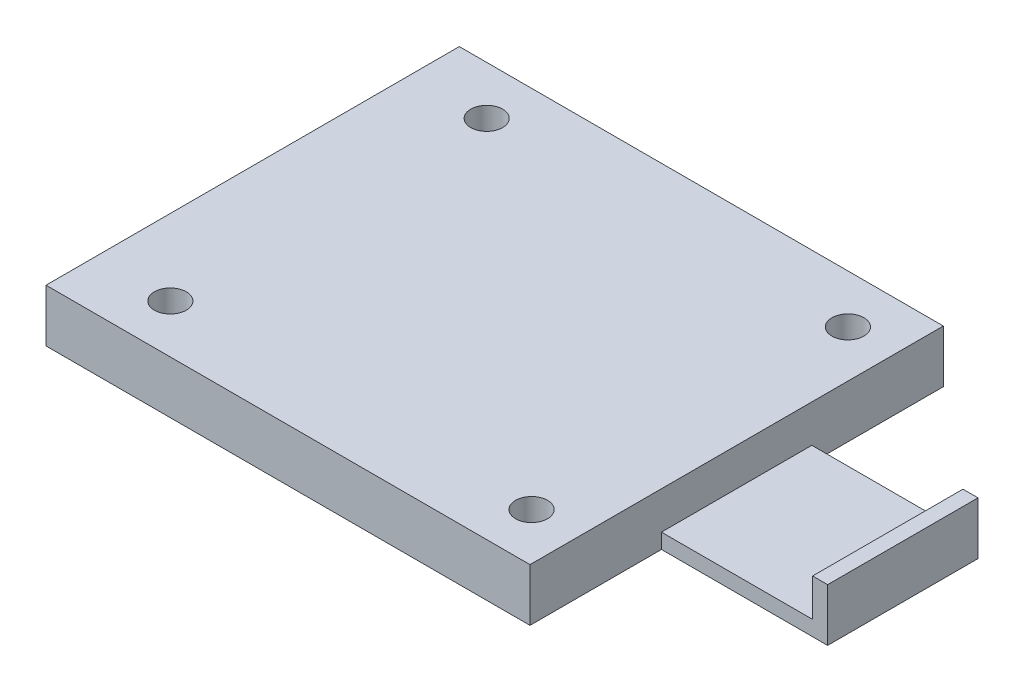
ISO-10303-21;
HEADER;
FILE_DESCRIPTION(('STEP AP214'),'2;1');
FILE_NAME('part.step','',(''),(''),'','','');
FILE_SCHEMA(('AUTOMOTIVE_DESIGN { 1 0 10303 214 1 1 1 1 }'));
ENDSEC;
DATA;
#1=APPLICATION_CONTEXT('core data for automotive mechanical design processes');
#2=APPLICATION_PROTOCOL_DEFINITION('international standard','automotive_design',2000,#1);
#3=PRODUCT_CONTEXT('',#1,'mechanical');
#4=PRODUCT('Part','Part','',(#3));
#5=PRODUCT_RELATED_PRODUCT_CATEGORY('part','',(#4));
#6=PRODUCT_DEFINITION_FORMATION('','',#4);
#7=PRODUCT_DEFINITION_CONTEXT('part definition',#1,'design');
#8=PRODUCT_DEFINITION('design','',#6,#7);
#9=PRODUCT_DEFINITION_SHAPE('','',#8);
#10=(LENGTH_UNIT() NAMED_UNIT(*) SI_UNIT(.MILLI.,.METRE.));
#11=(NAMED_UNIT(*) PLANE_ANGLE_UNIT() SI_UNIT($,.RADIAN.));
#12=(NAMED_UNIT(*) SI_UNIT($,.STERADIAN.) SOLID_ANGLE_UNIT());
#13=UNCERTAINTY_MEASURE_WITH_UNIT(LENGTH_MEASURE(1.E-05),#10,'distance_accuracy_value','');
#14=(GEOMETRIC_REPRESENTATION_CONTEXT(3) GLOBAL_UNCERTAINTY_ASSIGNED_CONTEXT((#13)) GLOBAL_UNIT_ASSIGNED_CONTEXT((#10,
#11,#12)) REPRESENTATION_CONTEXT('',''));
#15=CARTESIAN_POINT('',(0.,0.,0.));
#16=DIRECTION('',(0.,0.,1.));
#17=DIRECTION('',(1.,0.,0.));
#18=AXIS2_PLACEMENT_3D('',#15,#16,#17);
#19=CARTESIAN_POINT('',(32.1852743032001,7.,0.));
#20=DIRECTION('',(1.,0.,0.));
#21=DIRECTION('',(0.,0.,-1.));
#22=AXIS2_PLACEMENT_3D('',#19,#20,#21);
#23=PLANE('',#22);
#24=DIRECTION('',(0.,-1.,0.));
#25=VECTOR('',#24,1.);
#26=CARTESIAN_POINT('',(32.1852743032001,2.,10.));
#27=LINE('',#26,#25);
#28=CARTESIAN_POINT('',(32.1852743032001,2.,10.));
#29=VERTEX_POINT('',#28);
#30=CARTESIAN_POINT('',(32.1852743032001,0.,10.));
#31=VERTEX_POINT('',#30);
#32=EDGE_CURVE('E185',#29,#31,#27,.T.);
#33=ORIENTED_EDGE('',*,*,#32,.F.);
#34=DIRECTION('',(0.,0.,1.));
#35=VECTOR('',#34,1.);
#36=CARTESIAN_POINT('',(32.1852743032001,2.,0.));
#37=LINE('',#36,#35);
#38=CARTESIAN_POINT('',(32.1852743032001,2.,-10.));
#39=VERTEX_POINT('',#38);
#40=EDGE_CURVE('E182',#39,#29,#37,.T.);
#41=ORIENTED_EDGE('',*,*,#40,.F.);
#42=DIRECTION('',(0.,-1.,0.));
#43=VECTOR('',#42,1.);
#44=CARTESIAN_POINT('',(32.1852743032001,2.,-10.));
#45=LINE('',#44,#43);
#46=CARTESIAN_POINT('',(32.1852743032001,0.,-10.));
#47=VERTEX_POINT('',#46);
#48=EDGE_CURVE('E192',#39,#47,#45,.T.);
#49=ORIENTED_EDGE('',*,*,#48,.T.);
#50=DIRECTION('',(0.,0.,1.));
#51=VECTOR('',#50,1.);
#52=CARTESIAN_POINT('',(32.1852743032001,0.,0.));
#53=LINE('',#52,#51);
#54=CARTESIAN_POINT('',(32.1852743032001,0.,-27.4839162310667));
#55=VERTEX_POINT('',#54);
#56=EDGE_CURVE('E225',#55,#47,#53,.T.);
#57=ORIENTED_EDGE('',*,*,#56,.F.);
#58=DIRECTION('',(0.,-1.,0.));
#59=VECTOR('',#58,1.);
#60=CARTESIAN_POINT('',(32.1852743032001,7.,-27.4839162310667));
#61=LINE('',#60,#59);
#62=CARTESIAN_POINT('',(32.1852743032001,7.,-27.4839162310667));
#63=VERTEX_POINT('',#62);
#64=EDGE_CURVE('E11',#63,#55,#61,.T.);
#65=ORIENTED_EDGE('',*,*,#64,.F.);
#66=DIRECTION('',(0.,0.,1.));
#67=VECTOR('',#66,1.);
#68=CARTESIAN_POINT('',(32.1852743032001,7.,0.));
#69=LINE('',#68,#67);
#70=CARTESIAN_POINT('',(32.1852743032001,7.,27.4839162310667));
#71=VERTEX_POINT('',#70);
#72=EDGE_CURVE('E195',#63,#71,#69,.T.);
#73=ORIENTED_EDGE('',*,*,#72,.T.);
#74=DIRECTION('',(0.,-1.,0.));
#75=VECTOR('',#74,1.);
#76=CARTESIAN_POINT('',(32.1852743032001,7.,27.4839162310667));
#77=LINE('',#76,#75);
#78=CARTESIAN_POINT('',(32.1852743032001,0.,27.4839162310667));
#79=VERTEX_POINT('',#78);
#80=EDGE_CURVE('E224',#71,#79,#77,.T.);
#81=ORIENTED_EDGE('',*,*,#80,.T.);
#82=EDGE_CURVE('E86',#31,#79,#53,.T.);
#83=ORIENTED_EDGE('',*,*,#82,.F.);
#84=EDGE_LOOP('',(#33,#41,#49,#57,#65,#73,#81,#83));
#85=FACE_BOUND('',#84,.T.);
#86=ADVANCED_FACE('F41',(#85),#23,.T.);
#87=CARTESIAN_POINT('',(0.,7.,-27.4839162310667));
#88=DIRECTION('',(0.,0.,-1.));
#89=DIRECTION('',(-1.,0.,0.));
#90=AXIS2_PLACEMENT_3D('',#87,#88,#89);
#91=PLANE('',#90);
#92=DIRECTION('',(1.,0.,0.));
#93=VECTOR('',#92,1.);
#94=CARTESIAN_POINT('',(0.,0.,-27.4839162310667));
#95=LINE('',#94,#93);
#96=CARTESIAN_POINT('',(-32.1852743032001,0.,-27.4839162310667));
#97=VERTEX_POINT('',#96);
#98=EDGE_CURVE('E229',#97,#55,#95,.T.);
#99=ORIENTED_EDGE('',*,*,#98,.F.);
#100=DIRECTION('',(0.,-1.,0.));
#101=VECTOR('',#100,1.);
#102=CARTESIAN_POINT('',(-32.1852743032001,7.,-27.4839162310667));
#103=LINE('',#102,#101);
#104=CARTESIAN_POINT('',(-32.1852743032001,7.,-27.4839162310667));
#105=VERTEX_POINT('',#104);
#106=EDGE_CURVE('E49',#105,#97,#103,.T.);
#107=ORIENTED_EDGE('',*,*,#106,.F.);
#108=DIRECTION('',(1.,0.,0.));
#109=VECTOR('',#108,1.);
#110=CARTESIAN_POINT('',(0.,7.,-27.4839162310667));
#111=LINE('',#110,#109);
#112=EDGE_CURVE('E198',#105,#63,#111,.T.);
#113=ORIENTED_EDGE('',*,*,#112,.T.);
#114=ORIENTED_EDGE('',*,*,#64,.T.);
#115=EDGE_LOOP('',(#99,#107,#113,#114));
#116=FACE_BOUND('',#115,.T.);
#117=ADVANCED_FACE('F271',(#116),#91,.T.);
#118=CARTESIAN_POINT('',(-32.1852743032001,7.,0.));
#119=DIRECTION('',(1.,0.,0.));
#120=DIRECTION('',(0.,0.,-1.));
#121=AXIS2_PLACEMENT_3D('',#118,#119,#120);
#122=PLANE('',#121);
#123=DIRECTION('',(0.,0.,1.));
#124=VECTOR('',#123,1.);
#125=CARTESIAN_POINT('',(-32.1852743032001,0.,0.));
#126=LINE('',#125,#124);
#127=CARTESIAN_POINT('',(-32.1852743032001,0.,27.4839162310667));
#128=VERTEX_POINT('',#127);
#129=EDGE_CURVE('E233',#97,#128,#126,.T.);
#130=ORIENTED_EDGE('',*,*,#129,.T.);
#131=DIRECTION('',(0.,-1.,0.));
#132=VECTOR('',#131,1.);
#133=CARTESIAN_POINT('',(-32.1852743032001,7.,27.4839162310667));
#134=LINE('',#133,#132);
#135=CARTESIAN_POINT('',(-32.1852743032001,7.,27.4839162310667));
#136=VERTEX_POINT('',#135);
#137=EDGE_CURVE('E257',#136,#128,#134,.T.);
#138=ORIENTED_EDGE('',*,*,#137,.F.);
#139=DIRECTION('',(0.,0.,1.));
#140=VECTOR('',#139,1.);
#141=CARTESIAN_POINT('',(-32.1852743032001,7.,0.));
#142=LINE('',#141,#140);
#143=EDGE_CURVE('E203',#105,#136,#142,.T.);
#144=ORIENTED_EDGE('',*,*,#143,.F.);
#145=ORIENTED_EDGE('',*,*,#106,.T.);
#146=EDGE_LOOP('',(#130,#138,#144,#145));
#147=FACE_BOUND('',#146,.T.);
#148=ADVANCED_FACE('F264',(#147),#122,.F.);
#149=CARTESIAN_POINT('',(-22.094471989759,7.,-21.035));
#150=DIRECTION('',(0.,-1.,0.));
#151=DIRECTION('',(0.,0.,-1.));
#152=AXIS2_PLACEMENT_3D('',#149,#150,#151);
#153=CYLINDRICAL_SURFACE('',#152,2.125);
#154=CARTESIAN_POINT('',(-22.094471989759,7.,-21.035));
#155=DIRECTION('',(0.,1.,0.));
#156=DIRECTION('',(0.,0.,1.));
#157=AXIS2_PLACEMENT_3D('',#154,#155,#156);
#158=CIRCLE('',#157,2.125);
#159=CARTESIAN_POINT('',(-22.094471989759,7.,-18.91));
#160=VERTEX_POINT('',#159);
#161=EDGE_CURVE('E216',#160,#160,#158,.T.);
#162=ORIENTED_EDGE('',*,*,#161,.T.);
#163=EDGE_LOOP('',(#162));
#164=FACE_BOUND('',#163,.T.);
#165=CARTESIAN_POINT('',(-22.094471989759,0.,-21.035));
#166=DIRECTION('',(0.,1.,0.));
#167=DIRECTION('',(0.,0.,1.));
#168=AXIS2_PLACEMENT_3D('',#165,#166,#167);
#169=CIRCLE('',#168,2.125);
#170=CARTESIAN_POINT('',(-22.094471989759,0.,-18.91));
#171=VERTEX_POINT('',#170);
#172=EDGE_CURVE('E248',#171,#171,#169,.T.);
#173=ORIENTED_EDGE('',*,*,#172,.F.);
#174=EDGE_LOOP('',(#173));
#175=FACE_BOUND('',#174,.T.);
#176=ADVANCED_FACE('F307',(#164,#175),#153,.F.);
#177=CARTESIAN_POINT('',(-22.094471989759,7.,21.035));
#178=DIRECTION('',(0.,-1.,0.));
#179=DIRECTION('',(0.,0.,-1.));
#180=AXIS2_PLACEMENT_3D('',#177,#178,#179);
#181=CYLINDRICAL_SURFACE('',#180,2.125);
#182=CARTESIAN_POINT('',(-22.094471989759,7.,21.035));
#183=DIRECTION('',(0.,1.,0.));
#184=DIRECTION('',(0.,0.,1.));
#185=AXIS2_PLACEMENT_3D('',#182,#183,#184);
#186=CIRCLE('',#185,2.125);
#187=CARTESIAN_POINT('',(-22.094471989759,7.,23.16));
#188=VERTEX_POINT('',#187);
#189=EDGE_CURVE('E212',#188,#188,#186,.T.);
#190=ORIENTED_EDGE('',*,*,#189,.T.);
#191=EDGE_LOOP('',(#190));
#192=FACE_BOUND('',#191,.T.);
#193=CARTESIAN_POINT('',(-22.094471989759,0.,21.035));
#194=DIRECTION('',(0.,1.,0.));
#195=DIRECTION('',(0.,0.,1.));
#196=AXIS2_PLACEMENT_3D('',#193,#194,#195);
#197=CIRCLE('',#196,2.125);
#198=CARTESIAN_POINT('',(-22.094471989759,0.,23.16));
#199=VERTEX_POINT('',#198);
#200=EDGE_CURVE('E244',#199,#199,#197,.T.);
#201=ORIENTED_EDGE('',*,*,#200,.F.);
#202=EDGE_LOOP('',(#201));
#203=FACE_BOUND('',#202,.T.);
#204=ADVANCED_FACE('F296',(#192,#203),#181,.F.);
#205=CARTESIAN_POINT('',(25.945528010241,7.,21.035));
#206=DIRECTION('',(0.,-1.,0.));
#207=DIRECTION('',(0.,0.,-1.));
#208=AXIS2_PLACEMENT_3D('',#205,#206,#207);
#209=CYLINDRICAL_SURFACE('',#208,2.125);
#210=CARTESIAN_POINT('',(25.945528010241,7.,21.035));
#211=DIRECTION('',(0.,1.,0.));
#212=DIRECTION('',(0.,0.,1.));
#213=AXIS2_PLACEMENT_3D('',#210,#211,#212);
#214=CIRCLE('',#213,2.125);
#215=CARTESIAN_POINT('',(25.945528010241,7.,23.16));
#216=VERTEX_POINT('',#215);
#217=EDGE_CURVE('E208',#216,#216,#214,.T.);
#218=ORIENTED_EDGE('',*,*,#217,.T.);
#219=EDGE_LOOP('',(#218));
#220=FACE_BOUND('',#219,.T.);
#221=CARTESIAN_POINT('',(25.945528010241,0.,21.035));
#222=DIRECTION('',(0.,1.,0.));
#223=DIRECTION('',(0.,0.,1.));
#224=AXIS2_PLACEMENT_3D('',#221,#222,#223);
#225=CIRCLE('',#224,2.125);
#226=CARTESIAN_POINT('',(25.945528010241,0.,23.16));
#227=VERTEX_POINT('',#226);
#228=EDGE_CURVE('E240',#227,#227,#225,.T.);
#229=ORIENTED_EDGE('',*,*,#228,.F.);
#230=EDGE_LOOP('',(#229));
#231=FACE_BOUND('',#230,.T.);
#232=ADVANCED_FACE('F287',(#220,#231),#209,.F.);
#233=CARTESIAN_POINT('',(0.,7.,27.4839162310667));
#234=DIRECTION('',(0.,0.,-1.));
#235=DIRECTION('',(-1.,0.,0.));
#236=AXIS2_PLACEMENT_3D('',#233,#234,#235);
#237=PLANE('',#236);
#238=DIRECTION('',(1.,0.,0.));
#239=VECTOR('',#238,1.);
#240=CARTESIAN_POINT('',(0.,0.,27.4839162310667));
#241=LINE('',#240,#239);
#242=EDGE_CURVE('E236',#128,#79,#241,.T.);
#243=ORIENTED_EDGE('',*,*,#242,.T.);
#244=ORIENTED_EDGE('',*,*,#80,.F.);
#245=DIRECTION('',(1.,0.,0.));
#246=VECTOR('',#245,1.);
#247=CARTESIAN_POINT('',(0.,7.,27.4839162310667));
#248=LINE('',#247,#246);
#249=EDGE_CURVE('E65',#136,#71,#248,.T.);
#250=ORIENTED_EDGE('',*,*,#249,.F.);
#251=ORIENTED_EDGE('',*,*,#137,.T.);
#252=EDGE_LOOP('',(#243,#244,#250,#251));
#253=FACE_BOUND('',#252,.T.);
#254=ADVANCED_FACE('F284',(#253),#237,.F.);
#255=CARTESIAN_POINT('',(25.945528010241,7.,-21.035));
#256=DIRECTION('',(0.,-1.,0.));
#257=DIRECTION('',(0.,0.,-1.));
#258=AXIS2_PLACEMENT_3D('',#255,#256,#257);
#259=CYLINDRICAL_SURFACE('',#258,2.125);
#260=CARTESIAN_POINT('',(25.945528010241,7.,-21.035));
#261=DIRECTION('',(0.,1.,0.));
#262=DIRECTION('',(0.,0.,1.));
#263=AXIS2_PLACEMENT_3D('',#260,#261,#262);
#264=CIRCLE('',#263,2.125);
#265=CARTESIAN_POINT('',(25.945528010241,7.,-18.91));
#266=VERTEX_POINT('',#265);
#267=EDGE_CURVE('E220',#266,#266,#264,.T.);
#268=ORIENTED_EDGE('',*,*,#267,.T.);
#269=EDGE_LOOP('',(#268));
#270=FACE_BOUND('',#269,.T.);
#271=CARTESIAN_POINT('',(25.945528010241,0.,-21.035));
#272=DIRECTION('',(0.,1.,0.));
#273=DIRECTION('',(0.,0.,1.));
#274=AXIS2_PLACEMENT_3D('',#271,#272,#273);
#275=CIRCLE('',#274,2.125);
#276=CARTESIAN_POINT('',(25.945528010241,0.,-18.91));
#277=VERTEX_POINT('',#276);
#278=EDGE_CURVE('E199',#277,#277,#275,.T.);
#279=ORIENTED_EDGE('',*,*,#278,.F.);
#280=EDGE_LOOP('',(#279));
#281=FACE_BOUND('',#280,.T.);
#282=ADVANCED_FACE('F286',(#270,#281),#259,.F.);
#283=CARTESIAN_POINT('',(0.,7.,0.));
#284=DIRECTION('',(0.,1.,0.));
#285=DIRECTION('',(0.,0.,1.));
#286=AXIS2_PLACEMENT_3D('',#283,#284,#285);
#287=PLANE('',#286);
#288=ORIENTED_EDGE('',*,*,#72,.F.);
#289=ORIENTED_EDGE('',*,*,#112,.F.);
#290=ORIENTED_EDGE('',*,*,#143,.T.);
#291=ORIENTED_EDGE('',*,*,#249,.T.);
#292=EDGE_LOOP('',(#288,#289,#290,#291));
#293=FACE_BOUND('',#292,.T.);
#294=ORIENTED_EDGE('',*,*,#217,.F.);
#295=EDGE_LOOP('',(#294));
#296=FACE_BOUND('',#295,.T.);
#297=ORIENTED_EDGE('',*,*,#189,.F.);
#298=EDGE_LOOP('',(#297));
#299=FACE_BOUND('',#298,.T.);
#300=ORIENTED_EDGE('',*,*,#161,.F.);
#301=EDGE_LOOP('',(#300));
#302=FACE_BOUND('',#301,.T.);
#303=ORIENTED_EDGE('',*,*,#267,.F.);
#304=EDGE_LOOP('',(#303));
#305=FACE_BOUND('',#304,.T.);
#306=ADVANCED_FACE('F293',(#293,#296,#299,#302,#305),#287,.T.);
#307=CARTESIAN_POINT('',(0.,0.,0.));
#308=DIRECTION('',(0.,1.,0.));
#309=DIRECTION('',(0.,0.,1.));
#310=AXIS2_PLACEMENT_3D('',#307,#308,#309);
#311=PLANE('',#310);
#312=ORIENTED_EDGE('',*,*,#56,.T.);
#313=DIRECTION('',(-1.,0.,0.));
#314=VECTOR('',#313,1.);
#315=CARTESIAN_POINT('',(0.,0.,-9.99999999999998));
#316=LINE('',#315,#314);
#317=CARTESIAN_POINT('',(54.2852743032001,0.,-10.));
#318=VERTEX_POINT('',#317);
#319=EDGE_CURVE('E56',#318,#47,#316,.T.);
#320=ORIENTED_EDGE('',*,*,#319,.F.);
#321=DIRECTION('',(0.,0.,-1.));
#322=VECTOR('',#321,1.);
#323=CARTESIAN_POINT('',(54.2852743032001,0.,0.));
#324=LINE('',#323,#322);
#325=CARTESIAN_POINT('',(54.2852743032001,0.,10.));
#326=VERTEX_POINT('',#325);
#327=EDGE_CURVE('E156',#326,#318,#324,.T.);
#328=ORIENTED_EDGE('',*,*,#327,.F.);
#329=DIRECTION('',(1.,0.,0.));
#330=VECTOR('',#329,1.);
#331=CARTESIAN_POINT('',(0.,0.,10.));
#332=LINE('',#331,#330);
#333=EDGE_CURVE('E139',#31,#326,#332,.T.);
#334=ORIENTED_EDGE('',*,*,#333,.F.);
#335=ORIENTED_EDGE('',*,*,#82,.T.);
#336=ORIENTED_EDGE('',*,*,#242,.F.);
#337=ORIENTED_EDGE('',*,*,#129,.F.);
#338=ORIENTED_EDGE('',*,*,#98,.T.);
#339=EDGE_LOOP('',(#312,#320,#328,#334,#335,#336,#337,#338));
#340=FACE_BOUND('',#339,.T.);
#341=ORIENTED_EDGE('',*,*,#228,.T.);
#342=EDGE_LOOP('',(#341));
#343=FACE_BOUND('',#342,.T.);
#344=ORIENTED_EDGE('',*,*,#200,.T.);
#345=EDGE_LOOP('',(#344));
#346=FACE_BOUND('',#345,.T.);
#347=ORIENTED_EDGE('',*,*,#172,.T.);
#348=EDGE_LOOP('',(#347));
#349=FACE_BOUND('',#348,.T.);
#350=ORIENTED_EDGE('',*,*,#278,.T.);
#351=EDGE_LOOP('',(#350));
#352=FACE_BOUND('',#351,.T.);
#353=ADVANCED_FACE('F269',(#340,#343,#346,#349,#352),#311,.F.);
#354=CARTESIAN_POINT('',(0.,2.,10.));
#355=DIRECTION('',(0.,0.,-1.));
#356=DIRECTION('',(-1.,0.,0.));
#357=AXIS2_PLACEMENT_3D('',#354,#355,#356);
#358=PLANE('',#357);
#359=ORIENTED_EDGE('',*,*,#333,.T.);
#360=DIRECTION('',(0.,-1.,0.));
#361=VECTOR('',#360,1.);
#362=CARTESIAN_POINT('',(54.2852743032001,7.,10.));
#363=LINE('',#362,#361);
#364=CARTESIAN_POINT('',(54.2852743032001,7.,10.));
#365=VERTEX_POINT('',#364);
#366=EDGE_CURVE('E140',#365,#326,#363,.T.);
#367=ORIENTED_EDGE('',*,*,#366,.F.);
#368=DIRECTION('',(1.,0.,0.));
#369=VECTOR('',#368,1.);
#370=CARTESIAN_POINT('',(0.,7.,10.));
#371=LINE('',#370,#369);
#372=CARTESIAN_POINT('',(52.2852743032001,7.,10.));
#373=VERTEX_POINT('',#372);
#374=EDGE_CURVE('E143',#373,#365,#371,.T.);
#375=ORIENTED_EDGE('',*,*,#374,.F.);
#376=DIRECTION('',(0.,-1.,0.));
#377=VECTOR('',#376,1.);
#378=CARTESIAN_POINT('',(52.2852743032001,7.,10.));
#379=LINE('',#378,#377);
#380=CARTESIAN_POINT('',(52.2852743032001,2.,10.));
#381=VERTEX_POINT('',#380);
#382=EDGE_CURVE('E128',#373,#381,#379,.T.);
#383=ORIENTED_EDGE('',*,*,#382,.T.);
#384=DIRECTION('',(1.,0.,0.));
#385=VECTOR('',#384,1.);
#386=CARTESIAN_POINT('',(0.,2.,10.));
#387=LINE('',#386,#385);
#388=EDGE_CURVE('E174',#29,#381,#387,.T.);
#389=ORIENTED_EDGE('',*,*,#388,.F.);
#390=ORIENTED_EDGE('',*,*,#32,.T.);
#391=EDGE_LOOP('',(#359,#367,#375,#383,#389,#390));
#392=FACE_BOUND('',#391,.T.);
#393=ADVANCED_FACE('F144',(#392),#358,.F.);
#394=CARTESIAN_POINT('',(0.,2.,-9.99999999999998));
#395=DIRECTION('',(0.,0.,1.));
#396=DIRECTION('',(1.,0.,0.));
#397=AXIS2_PLACEMENT_3D('',#394,#395,#396);
#398=PLANE('',#397);
#399=ORIENTED_EDGE('',*,*,#319,.T.);
#400=ORIENTED_EDGE('',*,*,#48,.F.);
#401=DIRECTION('',(-1.,0.,0.));
#402=VECTOR('',#401,1.);
#403=CARTESIAN_POINT('',(0.,2.,-9.99999999999998));
#404=LINE('',#403,#402);
#405=CARTESIAN_POINT('',(52.2852743032001,2.,-10.));
#406=VERTEX_POINT('',#405);
#407=EDGE_CURVE('E179',#406,#39,#404,.T.);
#408=ORIENTED_EDGE('',*,*,#407,.F.);
#409=DIRECTION('',(0.,-1.,0.));
#410=VECTOR('',#409,1.);
#411=CARTESIAN_POINT('',(52.2852743032001,7.,-10.));
#412=LINE('',#411,#410);
#413=CARTESIAN_POINT('',(52.2852743032001,7.,-10.));
#414=VERTEX_POINT('',#413);
#415=EDGE_CURVE('E165',#414,#406,#412,.T.);
#416=ORIENTED_EDGE('',*,*,#415,.F.);
#417=DIRECTION('',(-1.,0.,0.));
#418=VECTOR('',#417,1.);
#419=CARTESIAN_POINT('',(0.,7.,-9.99999999999998));
#420=LINE('',#419,#418);
#421=CARTESIAN_POINT('',(54.2852743032001,7.,-10.));
#422=VERTEX_POINT('',#421);
#423=EDGE_CURVE('E153',#422,#414,#420,.T.);
#424=ORIENTED_EDGE('',*,*,#423,.F.);
#425=DIRECTION('',(0.,-1.,0.));
#426=VECTOR('',#425,1.);
#427=CARTESIAN_POINT('',(54.2852743032001,7.,-10.));
#428=LINE('',#427,#426);
#429=EDGE_CURVE('E169',#422,#318,#428,.T.);
#430=ORIENTED_EDGE('',*,*,#429,.T.);
#431=EDGE_LOOP('',(#399,#400,#408,#416,#424,#430));
#432=FACE_BOUND('',#431,.T.);
#433=ADVANCED_FACE('F278',(#432),#398,.F.);
#434=CARTESIAN_POINT('',(0.,2.,0.));
#435=DIRECTION('',(0.,1.,0.));
#436=DIRECTION('',(0.,0.,1.));
#437=AXIS2_PLACEMENT_3D('',#434,#435,#436);
#438=PLANE('',#437);
#439=ORIENTED_EDGE('',*,*,#388,.T.);
#440=DIRECTION('',(0.,0.,-1.));
#441=VECTOR('',#440,1.);
#442=CARTESIAN_POINT('',(52.2852743032001,2.,0.));
#443=LINE('',#442,#441);
#444=EDGE_CURVE('E134',#381,#406,#443,.T.);
#445=ORIENTED_EDGE('',*,*,#444,.T.);
#446=ORIENTED_EDGE('',*,*,#407,.T.);
#447=ORIENTED_EDGE('',*,*,#40,.T.);
#448=EDGE_LOOP('',(#439,#445,#446,#447));
#449=FACE_BOUND('',#448,.T.);
#450=ADVANCED_FACE('F281',(#449),#438,.T.);
#451=CARTESIAN_POINT('',(52.2852743032001,7.,0.));
#452=DIRECTION('',(-1.,0.,0.));
#453=DIRECTION('',(0.,0.,1.));
#454=AXIS2_PLACEMENT_3D('',#451,#452,#453);
#455=PLANE('',#454);
#456=ORIENTED_EDGE('',*,*,#444,.F.);
#457=ORIENTED_EDGE('',*,*,#382,.F.);
#458=DIRECTION('',(0.,0.,-1.));
#459=VECTOR('',#458,1.);
#460=CARTESIAN_POINT('',(52.2852743032001,7.,0.));
#461=LINE('',#460,#459);
#462=EDGE_CURVE('E132',#373,#414,#461,.T.);
#463=ORIENTED_EDGE('',*,*,#462,.T.);
#464=ORIENTED_EDGE('',*,*,#415,.T.);
#465=EDGE_LOOP('',(#456,#457,#463,#464));
#466=FACE_BOUND('',#465,.T.);
#467=ADVANCED_FACE('F130',(#466),#455,.T.);
#468=CARTESIAN_POINT('',(54.2852743032001,7.,0.));
#469=DIRECTION('',(-1.,0.,0.));
#470=DIRECTION('',(0.,0.,1.));
#471=AXIS2_PLACEMENT_3D('',#468,#469,#470);
#472=PLANE('',#471);
#473=ORIENTED_EDGE('',*,*,#327,.T.);
#474=ORIENTED_EDGE('',*,*,#429,.F.);
#475=DIRECTION('',(0.,0.,-1.));
#476=VECTOR('',#475,1.);
#477=CARTESIAN_POINT('',(54.2852743032001,7.,0.));
#478=LINE('',#477,#476);
#479=EDGE_CURVE('E149',#365,#422,#478,.T.);
#480=ORIENTED_EDGE('',*,*,#479,.F.);
#481=ORIENTED_EDGE('',*,*,#366,.T.);
#482=EDGE_LOOP('',(#473,#474,#480,#481));
#483=FACE_BOUND('',#482,.T.);
#484=ADVANCED_FACE('F277',(#483),#472,.F.);
#485=CARTESIAN_POINT('',(0.,7.,0.));
#486=DIRECTION('',(0.,1.,0.));
#487=DIRECTION('',(0.,0.,1.));
#488=AXIS2_PLACEMENT_3D('',#485,#486,#487);
#489=PLANE('',#488);
#490=ORIENTED_EDGE('',*,*,#462,.F.);
#491=ORIENTED_EDGE('',*,*,#374,.T.);
#492=ORIENTED_EDGE('',*,*,#479,.T.);
#493=ORIENTED_EDGE('',*,*,#423,.T.);
#494=EDGE_LOOP('',(#490,#491,#492,#493));
#495=FACE_BOUND('',#494,.T.);
#496=ADVANCED_FACE('F151',(#495),#489,.T.);
#497=CLOSED_SHELL('',(#86,#117,#148,#176,#204,#232,#254,#282,#306,#353,#393,#433,#450,#467,#484,#496));
#498=MANIFOLD_SOLID_BREP('B2',#497);
#499=ADVANCED_BREP_SHAPE_REPRESENTATION('',(#18,#498),#14);
#500=SHAPE_DEFINITION_REPRESENTATION(#9,#499);
ENDSEC;
END-ISO-10303-21;
